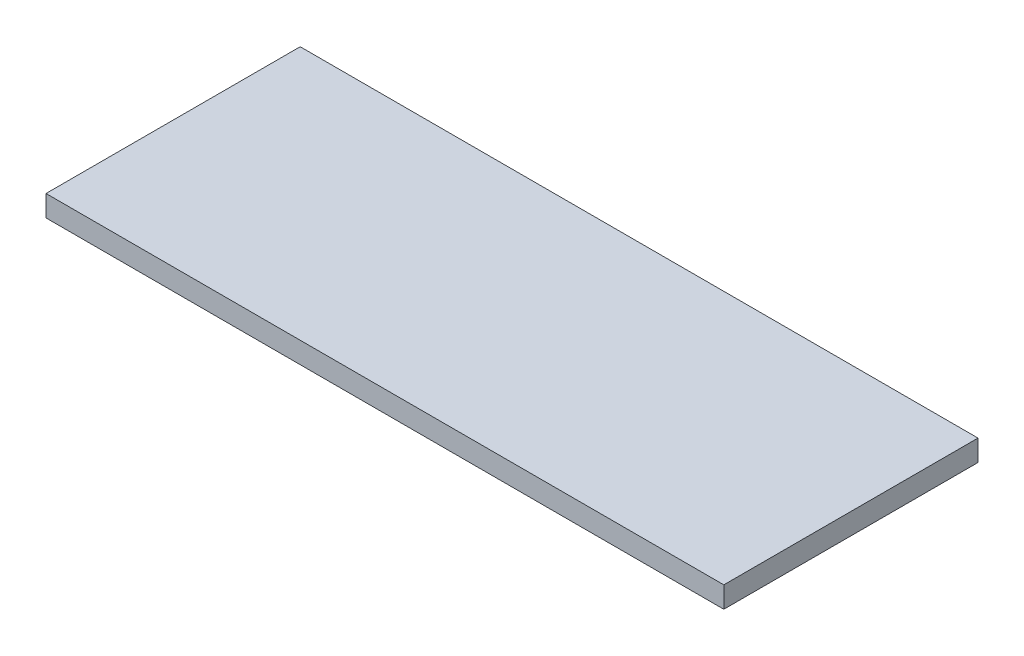
ISO-10303-21;
HEADER;
FILE_DESCRIPTION(('STEP AP214'),'2;1');
FILE_NAME('part.step','',(''),(''),'','','');
FILE_SCHEMA(('AUTOMOTIVE_DESIGN { 1 0 10303 214 1 1 1 1 }'));
ENDSEC;
DATA;
#1=APPLICATION_CONTEXT('core data for automotive mechanical design processes');
#2=APPLICATION_PROTOCOL_DEFINITION('international standard','automotive_design',2000,#1);
#3=PRODUCT_CONTEXT('',#1,'mechanical');
#4=PRODUCT('Part','Part','',(#3));
#5=PRODUCT_RELATED_PRODUCT_CATEGORY('part','',(#4));
#6=PRODUCT_DEFINITION_FORMATION('','',#4);
#7=PRODUCT_DEFINITION_CONTEXT('part definition',#1,'design');
#8=PRODUCT_DEFINITION('design','',#6,#7);
#9=PRODUCT_DEFINITION_SHAPE('','',#8);
#10=(LENGTH_UNIT() NAMED_UNIT(*) SI_UNIT(.MILLI.,.METRE.));
#11=(NAMED_UNIT(*) PLANE_ANGLE_UNIT() SI_UNIT($,.RADIAN.));
#12=(NAMED_UNIT(*) SI_UNIT($,.STERADIAN.) SOLID_ANGLE_UNIT());
#13=UNCERTAINTY_MEASURE_WITH_UNIT(LENGTH_MEASURE(1.E-05),#10,'distance_accuracy_value','');
#14=(GEOMETRIC_REPRESENTATION_CONTEXT(3) GLOBAL_UNCERTAINTY_ASSIGNED_CONTEXT((#13)) GLOBAL_UNIT_ASSIGNED_CONTEXT((#10,
#11,#12)) REPRESENTATION_CONTEXT('',''));
#15=CARTESIAN_POINT('',(0.,0.,0.));
#16=DIRECTION('',(0.,0.,1.));
#17=DIRECTION('',(1.,0.,0.));
#18=AXIS2_PLACEMENT_3D('',#15,#16,#17);
#19=CARTESIAN_POINT('',(80.,5.,30.));
#20=DIRECTION('',(-1.,0.,0.));
#21=DIRECTION('',(0.,0.,1.));
#22=AXIS2_PLACEMENT_3D('',#19,#20,#21);
#23=PLANE('',#22);
#24=DIRECTION('',(0.,0.,-1.));
#25=VECTOR('',#24,1.);
#26=CARTESIAN_POINT('',(80.,0.,30.));
#27=LINE('',#26,#25);
#28=CARTESIAN_POINT('',(80.,0.,30.));
#29=VERTEX_POINT('',#28);
#30=CARTESIAN_POINT('',(80.,0.,-30.));
#31=VERTEX_POINT('',#30);
#32=EDGE_CURVE('E100',#29,#31,#27,.T.);
#33=ORIENTED_EDGE('',*,*,#32,.T.);
#34=DIRECTION('',(0.,-1.,0.));
#35=VECTOR('',#34,1.);
#36=CARTESIAN_POINT('',(80.,5.,-30.));
#37=LINE('',#36,#35);
#38=CARTESIAN_POINT('',(80.,5.,-30.));
#39=VERTEX_POINT('',#38);
#40=EDGE_CURVE('E11',#39,#31,#37,.T.);
#41=ORIENTED_EDGE('',*,*,#40,.F.);
#42=DIRECTION('',(0.,0.,-1.));
#43=VECTOR('',#42,1.);
#44=CARTESIAN_POINT('',(80.,5.,30.));
#45=LINE('',#44,#43);
#46=CARTESIAN_POINT('',(80.,5.,30.));
#47=VERTEX_POINT('',#46);
#48=EDGE_CURVE('E88',#47,#39,#45,.T.);
#49=ORIENTED_EDGE('',*,*,#48,.F.);
#50=DIRECTION('',(0.,-1.,0.));
#51=VECTOR('',#50,1.);
#52=CARTESIAN_POINT('',(80.,5.,30.));
#53=LINE('',#52,#51);
#54=EDGE_CURVE('E96',#47,#29,#53,.T.);
#55=ORIENTED_EDGE('',*,*,#54,.T.);
#56=EDGE_LOOP('',(#33,#41,#49,#55));
#57=FACE_BOUND('',#56,.T.);
#58=ADVANCED_FACE('F37',(#57),#23,.F.);
#59=CARTESIAN_POINT('',(-80.,5.,-30.));
#60=DIRECTION('',(0.,0.,1.));
#61=DIRECTION('',(1.,0.,0.));
#62=AXIS2_PLACEMENT_3D('',#59,#60,#61);
#63=PLANE('',#62);
#64=DIRECTION('',(-1.,0.,0.));
#65=VECTOR('',#64,1.);
#66=CARTESIAN_POINT('',(-80.,0.,-30.));
#67=LINE('',#66,#65);
#68=CARTESIAN_POINT('',(-80.,0.,-30.));
#69=VERTEX_POINT('',#68);
#70=EDGE_CURVE('E92',#31,#69,#67,.T.);
#71=ORIENTED_EDGE('',*,*,#70,.T.);
#72=DIRECTION('',(0.,-1.,0.));
#73=VECTOR('',#72,1.);
#74=CARTESIAN_POINT('',(-80.,5.,-30.));
#75=LINE('',#74,#73);
#76=CARTESIAN_POINT('',(-80.,5.,-30.));
#77=VERTEX_POINT('',#76);
#78=EDGE_CURVE('E45',#77,#69,#75,.T.);
#79=ORIENTED_EDGE('',*,*,#78,.F.);
#80=DIRECTION('',(-1.,0.,0.));
#81=VECTOR('',#80,1.);
#82=CARTESIAN_POINT('',(-80.,5.,-30.));
#83=LINE('',#82,#81);
#84=EDGE_CURVE('E83',#39,#77,#83,.T.);
#85=ORIENTED_EDGE('',*,*,#84,.F.);
#86=ORIENTED_EDGE('',*,*,#40,.T.);
#87=EDGE_LOOP('',(#71,#79,#85,#86));
#88=FACE_BOUND('',#87,.T.);
#89=ADVANCED_FACE('F91',(#88),#63,.F.);
#90=CARTESIAN_POINT('',(-80.,5.,30.));
#91=DIRECTION('',(1.,0.,0.));
#92=DIRECTION('',(0.,0.,-1.));
#93=AXIS2_PLACEMENT_3D('',#90,#91,#92);
#94=PLANE('',#93);
#95=DIRECTION('',(0.,0.,1.));
#96=VECTOR('',#95,1.);
#97=CARTESIAN_POINT('',(-80.,0.,30.));
#98=LINE('',#97,#96);
#99=CARTESIAN_POINT('',(-80.,0.,30.));
#100=VERTEX_POINT('',#99);
#101=EDGE_CURVE('E70',#69,#100,#98,.T.);
#102=ORIENTED_EDGE('',*,*,#101,.T.);
#103=DIRECTION('',(0.,-1.,0.));
#104=VECTOR('',#103,1.);
#105=CARTESIAN_POINT('',(-80.,5.,30.));
#106=LINE('',#105,#104);
#107=CARTESIAN_POINT('',(-80.,5.,30.));
#108=VERTEX_POINT('',#107);
#109=EDGE_CURVE('E93',#108,#100,#106,.T.);
#110=ORIENTED_EDGE('',*,*,#109,.F.);
#111=DIRECTION('',(0.,0.,1.));
#112=VECTOR('',#111,1.);
#113=CARTESIAN_POINT('',(-80.,5.,30.));
#114=LINE('',#113,#112);
#115=EDGE_CURVE('E86',#77,#108,#114,.T.);
#116=ORIENTED_EDGE('',*,*,#115,.F.);
#117=ORIENTED_EDGE('',*,*,#78,.T.);
#118=EDGE_LOOP('',(#102,#110,#116,#117));
#119=FACE_BOUND('',#118,.T.);
#120=ADVANCED_FACE('F94',(#119),#94,.F.);
#121=CARTESIAN_POINT('',(-80.,5.,30.));
#122=DIRECTION('',(0.,0.,-1.));
#123=DIRECTION('',(-1.,0.,0.));
#124=AXIS2_PLACEMENT_3D('',#121,#122,#123);
#125=PLANE('',#124);
#126=DIRECTION('',(1.,0.,0.));
#127=VECTOR('',#126,1.);
#128=CARTESIAN_POINT('',(-80.,0.,30.));
#129=LINE('',#128,#127);
#130=EDGE_CURVE('E76',#100,#29,#129,.T.);
#131=ORIENTED_EDGE('',*,*,#130,.T.);
#132=ORIENTED_EDGE('',*,*,#54,.F.);
#133=DIRECTION('',(1.,0.,0.));
#134=VECTOR('',#133,1.);
#135=CARTESIAN_POINT('',(-80.,5.,30.));
#136=LINE('',#135,#134);
#137=EDGE_CURVE('E53',#108,#47,#136,.T.);
#138=ORIENTED_EDGE('',*,*,#137,.F.);
#139=ORIENTED_EDGE('',*,*,#109,.T.);
#140=EDGE_LOOP('',(#131,#132,#138,#139));
#141=FACE_BOUND('',#140,.T.);
#142=ADVANCED_FACE('F107',(#141),#125,.F.);
#143=CARTESIAN_POINT('',(0.,5.,0.));
#144=DIRECTION('',(0.,-1.,0.));
#145=DIRECTION('',(0.,0.,-1.));
#146=AXIS2_PLACEMENT_3D('',#143,#144,#145);
#147=PLANE('',#146);
#148=ORIENTED_EDGE('',*,*,#48,.T.);
#149=ORIENTED_EDGE('',*,*,#84,.T.);
#150=ORIENTED_EDGE('',*,*,#115,.T.);
#151=ORIENTED_EDGE('',*,*,#137,.T.);
#152=EDGE_LOOP('',(#148,#149,#150,#151));
#153=FACE_BOUND('',#152,.T.);
#154=ADVANCED_FACE('F84',(#153),#147,.F.);
#155=CARTESIAN_POINT('',(0.,0.,0.));
#156=DIRECTION('',(0.,-1.,0.));
#157=DIRECTION('',(0.,0.,-1.));
#158=AXIS2_PLACEMENT_3D('',#155,#156,#157);
#159=PLANE('',#158);
#160=ORIENTED_EDGE('',*,*,#32,.F.);
#161=ORIENTED_EDGE('',*,*,#130,.F.);
#162=ORIENTED_EDGE('',*,*,#101,.F.);
#163=ORIENTED_EDGE('',*,*,#70,.F.);
#164=EDGE_LOOP('',(#160,#161,#162,#163));
#165=FACE_BOUND('',#164,.T.);
#166=ADVANCED_FACE('F110',(#165),#159,.T.);
#167=CLOSED_SHELL('',(#58,#89,#120,#142,#154,#166));
#168=MANIFOLD_SOLID_BREP('B2',#167);
#169=ADVANCED_BREP_SHAPE_REPRESENTATION('',(#18,#168),#14);
#170=SHAPE_DEFINITION_REPRESENTATION(#9,#169);
ENDSEC;
END-ISO-10303-21;
